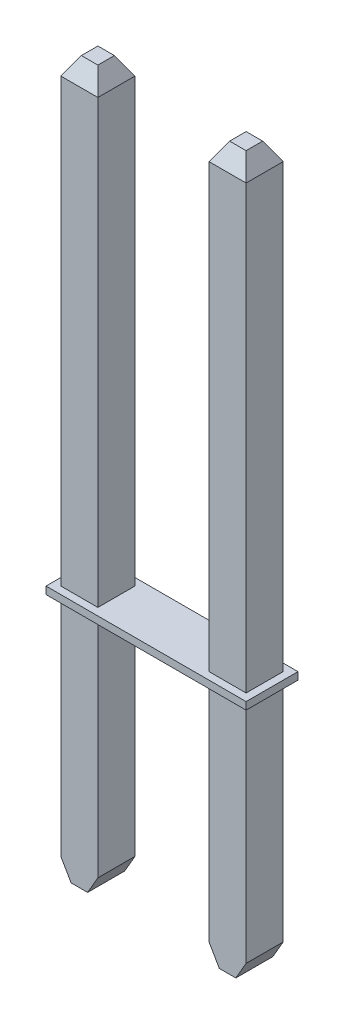
ISO-10303-21;
HEADER;
FILE_DESCRIPTION(('STEP AP214'),'2;1');
FILE_NAME('part.step','',(''),(''),'','','');
FILE_SCHEMA(('AUTOMOTIVE_DESIGN { 1 0 10303 214 1 1 1 1 }'));
ENDSEC;
DATA;
#1=APPLICATION_CONTEXT('core data for automotive mechanical design processes');
#2=APPLICATION_PROTOCOL_DEFINITION('international standard','automotive_design',2000,#1);
#3=PRODUCT_CONTEXT('',#1,'mechanical');
#4=PRODUCT('Part','Part','',(#3));
#5=PRODUCT_RELATED_PRODUCT_CATEGORY('part','',(#4));
#6=PRODUCT_DEFINITION_FORMATION('','',#4);
#7=PRODUCT_DEFINITION_CONTEXT('part definition',#1,'design');
#8=PRODUCT_DEFINITION('design','',#6,#7);
#9=PRODUCT_DEFINITION_SHAPE('','',#8);
#10=(LENGTH_UNIT() NAMED_UNIT(*) SI_UNIT(.MILLI.,.METRE.));
#11=(NAMED_UNIT(*) PLANE_ANGLE_UNIT() SI_UNIT($,.RADIAN.));
#12=(NAMED_UNIT(*) SI_UNIT($,.STERADIAN.) SOLID_ANGLE_UNIT());
#13=UNCERTAINTY_MEASURE_WITH_UNIT(LENGTH_MEASURE(1.E-05),#10,'distance_accuracy_value','');
#14=(GEOMETRIC_REPRESENTATION_CONTEXT(3) GLOBAL_UNCERTAINTY_ASSIGNED_CONTEXT((#13)) GLOBAL_UNIT_ASSIGNED_CONTEXT((#10,
#11,#12)) REPRESENTATION_CONTEXT('',''));
#15=CARTESIAN_POINT('',(0.,0.,0.));
#16=DIRECTION('',(0.,0.,1.));
#17=DIRECTION('',(1.,0.,0.));
#18=AXIS2_PLACEMENT_3D('',#15,#16,#17);
#19=CARTESIAN_POINT('',(0.,0.,-0.3175));
#20=DIRECTION('',(0.,0.,1.));
#21=DIRECTION('',(1.,0.,0.));
#22=AXIS2_PLACEMENT_3D('',#19,#20,#21);
#23=PLANE('',#22);
#24=DIRECTION('',(0.,1.,0.));
#25=VECTOR('',#24,1.);
#26=CARTESIAN_POINT('',(-1.5875,12.192,-0.3175));
#27=LINE('',#26,#25);
#28=CARTESIAN_POINT('',(-1.5875,0.3048,-0.3175));
#29=VERTEX_POINT('',#28);
#30=CARTESIAN_POINT('',(-1.5875,4.191,-0.3175));
#31=VERTEX_POINT('',#30);
#32=EDGE_CURVE('E11',#29,#31,#27,.T.);
#33=ORIENTED_EDGE('',*,*,#32,.T.);
#34=DIRECTION('',(-1.,0.,0.));
#35=VECTOR('',#34,1.);
#36=CARTESIAN_POINT('',(0.,4.191,-0.3175));
#37=LINE('',#36,#35);
#38=CARTESIAN_POINT('',(-0.9525,4.191,-0.3175));
#39=VERTEX_POINT('',#38);
#40=EDGE_CURVE('E467',#39,#31,#37,.T.);
#41=ORIENTED_EDGE('',*,*,#40,.F.);
#42=DIRECTION('',(0.,1.,0.));
#43=VECTOR('',#42,1.);
#44=CARTESIAN_POINT('',(-0.9525,4.191,-0.3175));
#45=LINE('',#44,#43);
#46=CARTESIAN_POINT('',(-0.9525,0.3048,-0.3175));
#47=VERTEX_POINT('',#46);
#48=EDGE_CURVE('E299',#47,#39,#45,.T.);
#49=ORIENTED_EDGE('',*,*,#48,.F.);
#50=DIRECTION('',(0.50000000000019,0.866025403784329,0.));
#51=VECTOR('',#50,1.);
#52=CARTESIAN_POINT('',(-0.9525,0.3048,-0.3175));
#53=LINE('',#52,#51);
#54=CARTESIAN_POINT('',(-1.128476362049,0.,-0.3175));
#55=VERTEX_POINT('',#54);
#56=EDGE_CURVE('E295',#55,#47,#53,.T.);
#57=ORIENTED_EDGE('',*,*,#56,.F.);
#58=DIRECTION('',(-1.,0.,0.));
#59=VECTOR('',#58,1.);
#60=CARTESIAN_POINT('',(-1.5875,0.,-0.3175));
#61=LINE('',#60,#59);
#62=CARTESIAN_POINT('',(-1.411523637951,0.,-0.3175));
#63=VERTEX_POINT('',#62);
#64=EDGE_CURVE('E311',#55,#63,#61,.T.);
#65=ORIENTED_EDGE('',*,*,#64,.T.);
#66=DIRECTION('',(0.50000000000019,-0.866025403784329,0.));
#67=VECTOR('',#66,1.);
#68=CARTESIAN_POINT('',(-1.411523637951,0.,-0.3175));
#69=LINE('',#68,#67);
#70=EDGE_CURVE('E25',#29,#63,#69,.T.);
#71=ORIENTED_EDGE('',*,*,#70,.F.);
#72=EDGE_LOOP('',(#33,#41,#49,#57,#65,#71));
#73=FACE_BOUND('',#72,.T.);
#74=ADVANCED_FACE('F17',(#73),#23,.F.);
#75=CARTESIAN_POINT('',(0.,0.,0.3175));
#76=DIRECTION('',(0.,0.,1.));
#77=DIRECTION('',(1.,0.,0.));
#78=AXIS2_PLACEMENT_3D('',#75,#76,#77);
#79=PLANE('',#78);
#80=DIRECTION('',(0.,1.,0.));
#81=VECTOR('',#80,1.);
#82=CARTESIAN_POINT('',(0.9525,-8.001,0.3175));
#83=LINE('',#82,#81);
#84=CARTESIAN_POINT('',(0.9525,0.3048,0.3175));
#85=VERTEX_POINT('',#84);
#86=CARTESIAN_POINT('',(0.9525,4.191,0.3175));
#87=VERTEX_POINT('',#86);
#88=EDGE_CURVE('E260',#85,#87,#83,.T.);
#89=ORIENTED_EDGE('',*,*,#88,.F.);
#90=DIRECTION('',(0.50000000000019,-0.866025403784329,0.));
#91=VECTOR('',#90,1.);
#92=CARTESIAN_POINT('',(0.9525,0.3048,0.3175));
#93=LINE('',#92,#91);
#94=CARTESIAN_POINT('',(1.128476362049,0.,0.3175));
#95=VERTEX_POINT('',#94);
#96=EDGE_CURVE('E264',#85,#95,#93,.T.);
#97=ORIENTED_EDGE('',*,*,#96,.T.);
#98=DIRECTION('',(1.,0.,0.));
#99=VECTOR('',#98,1.);
#100=CARTESIAN_POINT('',(0.,0.,0.3175));
#101=LINE('',#100,#99);
#102=CARTESIAN_POINT('',(1.411523637951,0.,0.3175));
#103=VERTEX_POINT('',#102);
#104=EDGE_CURVE('E292',#95,#103,#101,.T.);
#105=ORIENTED_EDGE('',*,*,#104,.T.);
#106=DIRECTION('',(0.50000000000019,0.866025403784329,0.));
#107=VECTOR('',#106,1.);
#108=CARTESIAN_POINT('',(1.411523637951,0.,0.3175));
#109=LINE('',#108,#107);
#110=CARTESIAN_POINT('',(1.5875,0.3048,0.3175));
#111=VERTEX_POINT('',#110);
#112=EDGE_CURVE('E666',#103,#111,#109,.T.);
#113=ORIENTED_EDGE('',*,*,#112,.T.);
#114=DIRECTION('',(0.,1.,0.));
#115=VECTOR('',#114,1.);
#116=CARTESIAN_POINT('',(1.5875,0.,0.3175));
#117=LINE('',#116,#115);
#118=CARTESIAN_POINT('',(1.5875,4.191,0.3175));
#119=VERTEX_POINT('',#118);
#120=EDGE_CURVE('E272',#111,#119,#117,.T.);
#121=ORIENTED_EDGE('',*,*,#120,.T.);
#122=DIRECTION('',(-1.,0.,0.));
#123=VECTOR('',#122,1.);
#124=CARTESIAN_POINT('',(0.,4.191,0.3175));
#125=LINE('',#124,#123);
#126=EDGE_CURVE('E267',#119,#87,#125,.T.);
#127=ORIENTED_EDGE('',*,*,#126,.T.);
#128=EDGE_LOOP('',(#89,#97,#105,#113,#121,#127));
#129=FACE_BOUND('',#128,.T.);
#130=ADVANCED_FACE('F262',(#129),#79,.T.);
#131=CARTESIAN_POINT('',(5.08,12.192,-0.141523637951));
#132=DIRECTION('',(0.,0.50000000000019,-0.866025403784329));
#133=DIRECTION('',(-1.,0.,0.));
#134=AXIS2_PLACEMENT_3D('',#131,#132,#133);
#135=PLANE('',#134);
#136=DIRECTION('',(1.,0.,0.));
#137=VECTOR('',#136,1.);
#138=CARTESIAN_POINT('',(1.5875,12.192,-0.141523637951));
#139=LINE('',#138,#137);
#140=CARTESIAN_POINT('',(1.128476362049,12.192,-0.141523637951));
#141=VERTEX_POINT('',#140);
#142=CARTESIAN_POINT('',(1.411523637951,12.192,-0.141523637951));
#143=VERTEX_POINT('',#142);
#144=EDGE_CURVE('E662',#141,#143,#139,.T.);
#145=ORIENTED_EDGE('',*,*,#144,.T.);
#146=DIRECTION('',(-0.44721359550015,0.774596669241261,0.44721359550015));
#147=VECTOR('',#146,1.);
#148=CARTESIAN_POINT('',(1.5875,11.8872,-0.3175));
#149=LINE('',#148,#147);
#150=CARTESIAN_POINT('',(1.5875,11.8872,-0.3175));
#151=VERTEX_POINT('',#150);
#152=EDGE_CURVE('E455',#151,#143,#149,.T.);
#153=ORIENTED_EDGE('',*,*,#152,.F.);
#154=DIRECTION('',(-1.,0.,0.));
#155=VECTOR('',#154,1.);
#156=CARTESIAN_POINT('',(0.,11.8872,-0.3175));
#157=LINE('',#156,#155);
#158=CARTESIAN_POINT('',(0.9525,11.8872,-0.3175));
#159=VERTEX_POINT('',#158);
#160=EDGE_CURVE('E607',#151,#159,#157,.T.);
#161=ORIENTED_EDGE('',*,*,#160,.T.);
#162=DIRECTION('',(-0.44721359550015,-0.774596669241261,-0.44721359550015));
#163=VECTOR('',#162,1.);
#164=CARTESIAN_POINT('',(1.128476362049,12.192,-0.141523637951));
#165=LINE('',#164,#163);
#166=EDGE_CURVE('E451',#141,#159,#165,.T.);
#167=ORIENTED_EDGE('',*,*,#166,.F.);
#168=EDGE_LOOP('',(#145,#153,#161,#167));
#169=FACE_BOUND('',#168,.T.);
#170=ADVANCED_FACE('F834',(#169),#135,.T.);
#171=CARTESIAN_POINT('',(-1.5875,12.192,0.3175));
#172=DIRECTION('',(1.,0.,0.));
#173=DIRECTION('',(0.,1.,0.));
#174=AXIS2_PLACEMENT_3D('',#171,#172,#173);
#175=PLANE('',#174);
#176=DIRECTION('',(0.,-1.,0.));
#177=VECTOR('',#176,1.);
#178=CARTESIAN_POINT('',(-1.5875,0.,0.3175));
#179=LINE('',#178,#177);
#180=CARTESIAN_POINT('',(-1.5875,4.191,0.3175));
#181=VERTEX_POINT('',#180);
#182=CARTESIAN_POINT('',(-1.5875,0.3048,0.3175));
#183=VERTEX_POINT('',#182);
#184=EDGE_CURVE('E394',#181,#183,#179,.T.);
#185=ORIENTED_EDGE('',*,*,#184,.F.);
#186=DIRECTION('',(0.,0.,1.));
#187=VECTOR('',#186,1.);
#188=CARTESIAN_POINT('',(-1.5875,4.191,0.3175));
#189=LINE('',#188,#187);
#190=EDGE_CURVE('E472',#31,#181,#189,.T.);
#191=ORIENTED_EDGE('',*,*,#190,.F.);
#192=ORIENTED_EDGE('',*,*,#32,.F.);
#193=DIRECTION('',(0.,0.,-1.));
#194=VECTOR('',#193,1.);
#195=CARTESIAN_POINT('',(-1.5875,0.3048,2.54));
#196=LINE('',#195,#194);
#197=EDGE_CURVE('E310',#183,#29,#196,.T.);
#198=ORIENTED_EDGE('',*,*,#197,.F.);
#199=EDGE_LOOP('',(#185,#191,#192,#198));
#200=FACE_BOUND('',#199,.T.);
#201=ADVANCED_FACE('F838',(#200),#175,.F.);
#202=CARTESIAN_POINT('',(-1.411523637951,0.,2.54));
#203=DIRECTION('',(-0.866025403784329,-0.50000000000019,0.));
#204=DIRECTION('',(-0.50000000000019,0.866025403784329,0.));
#205=AXIS2_PLACEMENT_3D('',#202,#203,#204);
#206=PLANE('',#205);
#207=DIRECTION('',(0.50000000000019,-0.866025403784329,0.));
#208=VECTOR('',#207,1.);
#209=CARTESIAN_POINT('',(-1.5875,0.3048,0.3175));
#210=LINE('',#209,#208);
#211=CARTESIAN_POINT('',(-1.411523637951,0.,0.3175));
#212=VERTEX_POINT('',#211);
#213=EDGE_CURVE('E627',#183,#212,#210,.T.);
#214=ORIENTED_EDGE('',*,*,#213,.F.);
#215=ORIENTED_EDGE('',*,*,#197,.T.);
#216=ORIENTED_EDGE('',*,*,#70,.T.);
#217=DIRECTION('',(0.,0.,1.));
#218=VECTOR('',#217,1.);
#219=CARTESIAN_POINT('',(-1.411523637951,0.,0.3175));
#220=LINE('',#219,#218);
#221=EDGE_CURVE('E307',#63,#212,#220,.T.);
#222=ORIENTED_EDGE('',*,*,#221,.T.);
#223=EDGE_LOOP('',(#214,#215,#216,#222));
#224=FACE_BOUND('',#223,.T.);
#225=ADVANCED_FACE('F852',(#224),#206,.T.);
#226=CARTESIAN_POINT('',(-1.5875,0.,0.3175));
#227=DIRECTION('',(0.,1.,0.));
#228=DIRECTION('',(1.,0.,0.));
#229=AXIS2_PLACEMENT_3D('',#226,#227,#228);
#230=PLANE('',#229);
#231=ORIENTED_EDGE('',*,*,#64,.F.);
#232=DIRECTION('',(0.,0.,-1.));
#233=VECTOR('',#232,1.);
#234=CARTESIAN_POINT('',(-1.128476362049,0.,2.54));
#235=LINE('',#234,#233);
#236=CARTESIAN_POINT('',(-1.128476362049,0.,0.3175));
#237=VERTEX_POINT('',#236);
#238=EDGE_CURVE('E303',#237,#55,#235,.T.);
#239=ORIENTED_EDGE('',*,*,#238,.F.);
#240=DIRECTION('',(1.,0.,0.));
#241=VECTOR('',#240,1.);
#242=CARTESIAN_POINT('',(0.,0.,0.3175));
#243=LINE('',#242,#241);
#244=EDGE_CURVE('E608',#212,#237,#243,.T.);
#245=ORIENTED_EDGE('',*,*,#244,.F.);
#246=ORIENTED_EDGE('',*,*,#221,.F.);
#247=EDGE_LOOP('',(#231,#239,#245,#246));
#248=FACE_BOUND('',#247,.T.);
#249=ADVANCED_FACE('F850',(#248),#230,.F.);
#250=CARTESIAN_POINT('',(-0.9525,0.3048,2.54));
#251=DIRECTION('',(0.866025403784329,-0.50000000000019,0.));
#252=DIRECTION('',(0.,0.,-1.));
#253=AXIS2_PLACEMENT_3D('',#250,#251,#252);
#254=PLANE('',#253);
#255=DIRECTION('',(0.50000000000019,0.866025403784329,0.));
#256=VECTOR('',#255,1.);
#257=CARTESIAN_POINT('',(-1.128476362049,0.,0.3175));
#258=LINE('',#257,#256);
#259=CARTESIAN_POINT('',(-0.9525,0.3048,0.3175));
#260=VERTEX_POINT('',#259);
#261=EDGE_CURVE('E602',#237,#260,#258,.T.);
#262=ORIENTED_EDGE('',*,*,#261,.F.);
#263=ORIENTED_EDGE('',*,*,#238,.T.);
#264=ORIENTED_EDGE('',*,*,#56,.T.);
#265=DIRECTION('',(0.,0.,-1.));
#266=VECTOR('',#265,1.);
#267=CARTESIAN_POINT('',(-0.9525,0.3048,2.54));
#268=LINE('',#267,#266);
#269=EDGE_CURVE('E302',#260,#47,#268,.T.);
#270=ORIENTED_EDGE('',*,*,#269,.F.);
#271=EDGE_LOOP('',(#262,#263,#264,#270));
#272=FACE_BOUND('',#271,.T.);
#273=ADVANCED_FACE('F847',(#272),#254,.T.);
#274=CARTESIAN_POINT('',(-0.9525,4.191,2.54));
#275=DIRECTION('',(1.,0.,0.));
#276=DIRECTION('',(0.,1.,0.));
#277=AXIS2_PLACEMENT_3D('',#274,#275,#276);
#278=PLANE('',#277);
#279=ORIENTED_EDGE('',*,*,#48,.T.);
#280=DIRECTION('',(0.,0.,1.));
#281=VECTOR('',#280,1.);
#282=CARTESIAN_POINT('',(-0.9525,4.191,2.54));
#283=LINE('',#282,#281);
#284=CARTESIAN_POINT('',(-0.9525,4.191,0.3175));
#285=VERTEX_POINT('',#284);
#286=EDGE_CURVE('E473',#39,#285,#283,.T.);
#287=ORIENTED_EDGE('',*,*,#286,.T.);
#288=DIRECTION('',(0.,1.,0.));
#289=VECTOR('',#288,1.);
#290=CARTESIAN_POINT('',(-0.9525,0.,0.3175));
#291=LINE('',#290,#289);
#292=EDGE_CURVE('E390',#260,#285,#291,.T.);
#293=ORIENTED_EDGE('',*,*,#292,.F.);
#294=ORIENTED_EDGE('',*,*,#269,.T.);
#295=EDGE_LOOP('',(#279,#287,#293,#294));
#296=FACE_BOUND('',#295,.T.);
#297=ADVANCED_FACE('F843',(#296),#278,.T.);
#298=CARTESIAN_POINT('',(1.5875,0.,0.3175));
#299=DIRECTION('',(-1.,0.,0.));
#300=DIRECTION('',(0.,0.,1.));
#301=AXIS2_PLACEMENT_3D('',#298,#299,#300);
#302=PLANE('',#301);
#303=DIRECTION('',(0.,1.,0.));
#304=VECTOR('',#303,1.);
#305=CARTESIAN_POINT('',(1.5875,0.,-0.3175));
#306=LINE('',#305,#304);
#307=CARTESIAN_POINT('',(1.5875,0.3048,-0.3175));
#308=VERTEX_POINT('',#307);
#309=CARTESIAN_POINT('',(1.5875,4.191,-0.3175));
#310=VERTEX_POINT('',#309);
#311=EDGE_CURVE('E620',#308,#310,#306,.T.);
#312=ORIENTED_EDGE('',*,*,#311,.T.);
#313=DIRECTION('',(0.,0.,-1.));
#314=VECTOR('',#313,1.);
#315=CARTESIAN_POINT('',(1.5875,4.191,0.3175));
#316=LINE('',#315,#314);
#317=EDGE_CURVE('E543',#119,#310,#316,.T.);
#318=ORIENTED_EDGE('',*,*,#317,.F.);
#319=ORIENTED_EDGE('',*,*,#120,.F.);
#320=DIRECTION('',(0.,0.,1.));
#321=VECTOR('',#320,1.);
#322=CARTESIAN_POINT('',(1.5875,0.3048,2.54));
#323=LINE('',#322,#321);
#324=EDGE_CURVE('E576',#308,#111,#323,.T.);
#325=ORIENTED_EDGE('',*,*,#324,.F.);
#326=EDGE_LOOP('',(#312,#318,#319,#325));
#327=FACE_BOUND('',#326,.T.);
#328=ADVANCED_FACE('F1087',(#327),#302,.F.);
#329=CARTESIAN_POINT('',(0.9525,-8.001,2.54));
#330=DIRECTION('',(-1.,0.,0.));
#331=DIRECTION('',(0.,0.,1.));
#332=AXIS2_PLACEMENT_3D('',#329,#330,#331);
#333=PLANE('',#332);
#334=ORIENTED_EDGE('',*,*,#88,.T.);
#335=DIRECTION('',(0.,0.,-1.));
#336=VECTOR('',#335,1.);
#337=CARTESIAN_POINT('',(0.9525,4.191,2.54));
#338=LINE('',#337,#336);
#339=CARTESIAN_POINT('',(0.9525,4.191,-0.3175));
#340=VERTEX_POINT('',#339);
#341=EDGE_CURVE('E508',#87,#340,#338,.T.);
#342=ORIENTED_EDGE('',*,*,#341,.T.);
#343=DIRECTION('',(0.,-1.,0.));
#344=VECTOR('',#343,1.);
#345=CARTESIAN_POINT('',(0.9525,0.,-0.3175));
#346=LINE('',#345,#344);
#347=CARTESIAN_POINT('',(0.9525,0.3048,-0.3175));
#348=VERTEX_POINT('',#347);
#349=EDGE_CURVE('E277',#340,#348,#346,.T.);
#350=ORIENTED_EDGE('',*,*,#349,.T.);
#351=DIRECTION('',(0.,0.,-1.));
#352=VECTOR('',#351,1.);
#353=CARTESIAN_POINT('',(0.9525,0.3048,2.54));
#354=LINE('',#353,#352);
#355=EDGE_CURVE('E273',#85,#348,#354,.T.);
#356=ORIENTED_EDGE('',*,*,#355,.F.);
#357=EDGE_LOOP('',(#334,#342,#350,#356));
#358=FACE_BOUND('',#357,.T.);
#359=ADVANCED_FACE('F276',(#358),#333,.T.);
#360=CARTESIAN_POINT('',(1.128476362049,0.,2.54));
#361=DIRECTION('',(-0.866025403784329,-0.50000000000019,0.));
#362=DIRECTION('',(-0.50000000000019,0.866025403784329,0.));
#363=AXIS2_PLACEMENT_3D('',#360,#361,#362);
#364=PLANE('',#363);
#365=ORIENTED_EDGE('',*,*,#96,.F.);
#366=ORIENTED_EDGE('',*,*,#355,.T.);
#367=DIRECTION('',(0.50000000000019,-0.866025403784329,0.));
#368=VECTOR('',#367,1.);
#369=CARTESIAN_POINT('',(0.9525,0.3048,-0.3175));
#370=LINE('',#369,#368);
#371=CARTESIAN_POINT('',(1.128476362049,0.,-0.3175));
#372=VERTEX_POINT('',#371);
#373=EDGE_CURVE('E598',#348,#372,#370,.T.);
#374=ORIENTED_EDGE('',*,*,#373,.T.);
#375=DIRECTION('',(0.,0.,1.));
#376=VECTOR('',#375,1.);
#377=CARTESIAN_POINT('',(1.128476362049,0.,0.3175));
#378=LINE('',#377,#376);
#379=EDGE_CURVE('E284',#372,#95,#378,.T.);
#380=ORIENTED_EDGE('',*,*,#379,.T.);
#381=EDGE_LOOP('',(#365,#366,#374,#380));
#382=FACE_BOUND('',#381,.T.);
#383=ADVANCED_FACE('F283',(#382),#364,.T.);
#384=CARTESIAN_POINT('',(-1.5875,0.,0.3175));
#385=DIRECTION('',(0.,1.,0.));
#386=DIRECTION('',(1.,0.,0.));
#387=AXIS2_PLACEMENT_3D('',#384,#385,#386);
#388=PLANE('',#387);
#389=ORIENTED_EDGE('',*,*,#104,.F.);
#390=ORIENTED_EDGE('',*,*,#379,.F.);
#391=DIRECTION('',(1.,0.,0.));
#392=VECTOR('',#391,1.);
#393=CARTESIAN_POINT('',(0.,0.,-0.3175));
#394=LINE('',#393,#392);
#395=CARTESIAN_POINT('',(1.411523637951,0.,-0.3175));
#396=VERTEX_POINT('',#395);
#397=EDGE_CURVE('E416',#372,#396,#394,.T.);
#398=ORIENTED_EDGE('',*,*,#397,.T.);
#399=DIRECTION('',(0.,0.,-1.));
#400=VECTOR('',#399,1.);
#401=CARTESIAN_POINT('',(1.411523637951,0.,2.54));
#402=LINE('',#401,#400);
#403=EDGE_CURVE('E672',#103,#396,#402,.T.);
#404=ORIENTED_EDGE('',*,*,#403,.F.);
#405=EDGE_LOOP('',(#389,#390,#398,#404));
#406=FACE_BOUND('',#405,.T.);
#407=ADVANCED_FACE('F1050',(#406),#388,.F.);
#408=CARTESIAN_POINT('',(1.5875,0.3048,2.54));
#409=DIRECTION('',(0.866025403784329,-0.50000000000019,0.));
#410=DIRECTION('',(0.,0.,-1.));
#411=AXIS2_PLACEMENT_3D('',#408,#409,#410);
#412=PLANE('',#411);
#413=ORIENTED_EDGE('',*,*,#112,.F.);
#414=ORIENTED_EDGE('',*,*,#403,.T.);
#415=DIRECTION('',(0.50000000000019,0.866025403784329,0.));
#416=VECTOR('',#415,1.);
#417=CARTESIAN_POINT('',(1.411523637951,0.,-0.3175));
#418=LINE('',#417,#416);
#419=EDGE_CURVE('E395',#396,#308,#418,.T.);
#420=ORIENTED_EDGE('',*,*,#419,.T.);
#421=ORIENTED_EDGE('',*,*,#324,.T.);
#422=EDGE_LOOP('',(#413,#414,#420,#421));
#423=FACE_BOUND('',#422,.T.);
#424=ADVANCED_FACE('F1038',(#423),#412,.T.);
#425=CARTESIAN_POINT('',(1.5875,12.192,0.3175));
#426=DIRECTION('',(0.,-1.,0.));
#427=DIRECTION('',(0.,0.,-1.));
#428=AXIS2_PLACEMENT_3D('',#425,#426,#427);
#429=PLANE('',#428);
#430=DIRECTION('',(-1.,0.,0.));
#431=VECTOR('',#430,1.);
#432=CARTESIAN_POINT('',(5.08,12.192,0.141523637951));
#433=LINE('',#432,#431);
#434=CARTESIAN_POINT('',(1.411523637951,12.192,0.141523637951));
#435=VERTEX_POINT('',#434);
#436=CARTESIAN_POINT('',(1.128476362049,12.192,0.141523637951));
#437=VERTEX_POINT('',#436);
#438=EDGE_CURVE('E435',#435,#437,#433,.T.);
#439=ORIENTED_EDGE('',*,*,#438,.F.);
#440=DIRECTION('',(0.,0.,1.));
#441=VECTOR('',#440,1.);
#442=CARTESIAN_POINT('',(1.411523637951,12.192,2.54));
#443=LINE('',#442,#441);
#444=EDGE_CURVE('E658',#143,#435,#443,.T.);
#445=ORIENTED_EDGE('',*,*,#444,.F.);
#446=ORIENTED_EDGE('',*,*,#144,.F.);
#447=DIRECTION('',(0.,0.,-1.));
#448=VECTOR('',#447,1.);
#449=CARTESIAN_POINT('',(1.128476362049,12.192,2.54));
#450=LINE('',#449,#448);
#451=EDGE_CURVE('E456',#437,#141,#450,.T.);
#452=ORIENTED_EDGE('',*,*,#451,.F.);
#453=EDGE_LOOP('',(#439,#445,#446,#452));
#454=FACE_BOUND('',#453,.T.);
#455=ADVANCED_FACE('F1027',(#454),#429,.F.);
#456=CARTESIAN_POINT('',(1.411523637951,12.192,2.54));
#457=DIRECTION('',(0.866025403784329,0.50000000000019,0.));
#458=DIRECTION('',(0.,0.,-1.));
#459=AXIS2_PLACEMENT_3D('',#456,#457,#458);
#460=PLANE('',#459);
#461=DIRECTION('',(0.,0.,-1.));
#462=VECTOR('',#461,1.);
#463=CARTESIAN_POINT('',(1.5875,11.8872,0.3175));
#464=LINE('',#463,#462);
#465=CARTESIAN_POINT('',(1.5875,11.8872,0.3175));
#466=VERTEX_POINT('',#465);
#467=EDGE_CURVE('E376',#466,#151,#464,.T.);
#468=ORIENTED_EDGE('',*,*,#467,.T.);
#469=ORIENTED_EDGE('',*,*,#152,.T.);
#470=ORIENTED_EDGE('',*,*,#444,.T.);
#471=DIRECTION('',(-0.44721359550015,0.774596669241261,-0.44721359550015));
#472=VECTOR('',#471,1.);
#473=CARTESIAN_POINT('',(1.5875,11.8872,0.3175));
#474=LINE('',#473,#472);
#475=EDGE_CURVE('E440',#466,#435,#474,.T.);
#476=ORIENTED_EDGE('',*,*,#475,.F.);
#477=EDGE_LOOP('',(#468,#469,#470,#476));
#478=FACE_BOUND('',#477,.T.);
#479=ADVANCED_FACE('F1016',(#478),#460,.T.);
#480=CARTESIAN_POINT('',(0.9525,11.8872,2.54));
#481=DIRECTION('',(-0.866025403784329,0.50000000000019,0.));
#482=DIRECTION('',(0.,0.,1.));
#483=AXIS2_PLACEMENT_3D('',#480,#481,#482);
#484=PLANE('',#483);
#485=ORIENTED_EDGE('',*,*,#451,.T.);
#486=ORIENTED_EDGE('',*,*,#166,.T.);
#487=DIRECTION('',(0.,0.,-1.));
#488=VECTOR('',#487,1.);
#489=CARTESIAN_POINT('',(0.9525,11.8872,2.54));
#490=LINE('',#489,#488);
#491=CARTESIAN_POINT('',(0.9525,11.8872,0.3175));
#492=VERTEX_POINT('',#491);
#493=EDGE_CURVE('E582',#492,#159,#490,.T.);
#494=ORIENTED_EDGE('',*,*,#493,.F.);
#495=DIRECTION('',(-0.44721359550015,-0.774596669241261,0.44721359550015));
#496=VECTOR('',#495,1.);
#497=CARTESIAN_POINT('',(1.128476362049,12.192,0.141523637951));
#498=LINE('',#497,#496);
#499=EDGE_CURVE('E377',#437,#492,#498,.T.);
#500=ORIENTED_EDGE('',*,*,#499,.F.);
#501=EDGE_LOOP('',(#485,#486,#494,#500));
#502=FACE_BOUND('',#501,.T.);
#503=ADVANCED_FACE('F866',(#502),#484,.T.);
#504=CARTESIAN_POINT('',(0.,0.,-0.3175));
#505=DIRECTION('',(0.,0.,1.));
#506=DIRECTION('',(1.,0.,0.));
#507=AXIS2_PLACEMENT_3D('',#504,#505,#506);
#508=PLANE('',#507);
#509=DIRECTION('',(0.,-1.,0.));
#510=VECTOR('',#509,1.);
#511=CARTESIAN_POINT('',(1.5875,0.,-0.3175));
#512=LINE('',#511,#510);
#513=CARTESIAN_POINT('',(1.5875,4.318,-0.3175));
#514=VERTEX_POINT('',#513);
#515=EDGE_CURVE('E372',#151,#514,#512,.T.);
#516=ORIENTED_EDGE('',*,*,#515,.T.);
#517=DIRECTION('',(1.,0.,0.));
#518=VECTOR('',#517,1.);
#519=CARTESIAN_POINT('',(0.,4.318,-0.3175));
#520=LINE('',#519,#518);
#521=CARTESIAN_POINT('',(0.9525,4.318,-0.3175));
#522=VERTEX_POINT('',#521);
#523=EDGE_CURVE('E723',#522,#514,#520,.T.);
#524=ORIENTED_EDGE('',*,*,#523,.F.);
#525=DIRECTION('',(0.,-1.,0.));
#526=VECTOR('',#525,1.);
#527=CARTESIAN_POINT('',(0.9525,4.318,-0.3175));
#528=LINE('',#527,#526);
#529=EDGE_CURVE('E569',#159,#522,#528,.T.);
#530=ORIENTED_EDGE('',*,*,#529,.F.);
#531=ORIENTED_EDGE('',*,*,#160,.F.);
#532=EDGE_LOOP('',(#516,#524,#530,#531));
#533=FACE_BOUND('',#532,.T.);
#534=ADVANCED_FACE('F857',(#533),#508,.F.);
#535=CARTESIAN_POINT('',(0.,0.,0.3175));
#536=DIRECTION('',(0.,0.,1.));
#537=DIRECTION('',(1.,0.,0.));
#538=AXIS2_PLACEMENT_3D('',#535,#536,#537);
#539=PLANE('',#538);
#540=ORIENTED_EDGE('',*,*,#292,.T.);
#541=DIRECTION('',(-1.,0.,0.));
#542=VECTOR('',#541,1.);
#543=CARTESIAN_POINT('',(1.7145,4.191,0.3175));
#544=LINE('',#543,#542);
#545=EDGE_CURVE('E562',#285,#181,#544,.T.);
#546=ORIENTED_EDGE('',*,*,#545,.T.);
#547=ORIENTED_EDGE('',*,*,#184,.T.);
#548=ORIENTED_EDGE('',*,*,#213,.T.);
#549=ORIENTED_EDGE('',*,*,#244,.T.);
#550=ORIENTED_EDGE('',*,*,#261,.T.);
#551=EDGE_LOOP('',(#540,#546,#547,#548,#549,#550));
#552=FACE_BOUND('',#551,.T.);
#553=ADVANCED_FACE('F854',(#552),#539,.T.);
#554=CARTESIAN_POINT('',(0.,0.,-0.3175));
#555=DIRECTION('',(0.,0.,1.));
#556=DIRECTION('',(1.,0.,0.));
#557=AXIS2_PLACEMENT_3D('',#554,#555,#556);
#558=PLANE('',#557);
#559=ORIENTED_EDGE('',*,*,#397,.F.);
#560=ORIENTED_EDGE('',*,*,#373,.F.);
#561=ORIENTED_EDGE('',*,*,#349,.F.);
#562=DIRECTION('',(1.,0.,0.));
#563=VECTOR('',#562,1.);
#564=CARTESIAN_POINT('',(1.7145,4.191,-0.3175));
#565=LINE('',#564,#563);
#566=EDGE_CURVE('E550',#340,#310,#565,.T.);
#567=ORIENTED_EDGE('',*,*,#566,.T.);
#568=ORIENTED_EDGE('',*,*,#311,.F.);
#569=ORIENTED_EDGE('',*,*,#419,.F.);
#570=EDGE_LOOP('',(#559,#560,#561,#567,#568,#569));
#571=FACE_BOUND('',#570,.T.);
#572=ADVANCED_FACE('F856',(#571),#558,.F.);
#573=CARTESIAN_POINT('',(-1.5875,11.8872,2.54));
#574=DIRECTION('',(-0.866025403784329,0.50000000000019,0.));
#575=DIRECTION('',(0.,0.,1.));
#576=AXIS2_PLACEMENT_3D('',#573,#574,#575);
#577=PLANE('',#576);
#578=DIRECTION('',(0.,0.,-1.));
#579=VECTOR('',#578,1.);
#580=CARTESIAN_POINT('',(-1.411523637951,12.192,0.3175));
#581=LINE('',#580,#579);
#582=CARTESIAN_POINT('',(-1.411523637951,12.192,0.141523637951));
#583=VERTEX_POINT('',#582);
#584=CARTESIAN_POINT('',(-1.411523637951,12.192,-0.141523637951));
#585=VERTEX_POINT('',#584);
#586=EDGE_CURVE('E512',#583,#585,#581,.T.);
#587=ORIENTED_EDGE('',*,*,#586,.T.);
#588=DIRECTION('',(0.44721359550015,0.774596669241261,0.44721359550015));
#589=VECTOR('',#588,1.);
#590=CARTESIAN_POINT('',(-1.5875,11.8872,-0.3175));
#591=LINE('',#590,#589);
#592=CARTESIAN_POINT('',(-1.5875,11.8872,-0.3175));
#593=VERTEX_POINT('',#592);
#594=EDGE_CURVE('E530',#593,#585,#591,.T.);
#595=ORIENTED_EDGE('',*,*,#594,.F.);
#596=DIRECTION('',(0.,0.,1.));
#597=VECTOR('',#596,1.);
#598=CARTESIAN_POINT('',(-1.5875,11.8872,0.3175));
#599=LINE('',#598,#597);
#600=CARTESIAN_POINT('',(-1.5875,11.8872,0.3175));
#601=VERTEX_POINT('',#600);
#602=EDGE_CURVE('E499',#593,#601,#599,.T.);
#603=ORIENTED_EDGE('',*,*,#602,.T.);
#604=DIRECTION('',(-0.44721359550015,-0.774596669241261,0.44721359550015));
#605=VECTOR('',#604,1.);
#606=CARTESIAN_POINT('',(-1.411523637951,12.192,0.141523637951));
#607=LINE('',#606,#605);
#608=EDGE_CURVE('E520',#583,#601,#607,.T.);
#609=ORIENTED_EDGE('',*,*,#608,.F.);
#610=EDGE_LOOP('',(#587,#595,#603,#609));
#611=FACE_BOUND('',#610,.T.);
#612=ADVANCED_FACE('F811',(#611),#577,.T.);
#613=CARTESIAN_POINT('',(1.5875,0.,0.3175));
#614=DIRECTION('',(-1.,0.,0.));
#615=DIRECTION('',(0.,0.,1.));
#616=AXIS2_PLACEMENT_3D('',#613,#614,#615);
#617=PLANE('',#616);
#618=DIRECTION('',(0.,1.,0.));
#619=VECTOR('',#618,1.);
#620=CARTESIAN_POINT('',(1.5875,0.,0.3175));
#621=LINE('',#620,#619);
#622=CARTESIAN_POINT('',(1.5875,4.318,0.3175));
#623=VERTEX_POINT('',#622);
#624=EDGE_CURVE('E488',#623,#466,#621,.T.);
#625=ORIENTED_EDGE('',*,*,#624,.F.);
#626=DIRECTION('',(0.,0.,1.));
#627=VECTOR('',#626,1.);
#628=CARTESIAN_POINT('',(1.5875,4.318,0.3175));
#629=LINE('',#628,#627);
#630=EDGE_CURVE('E722',#514,#623,#629,.T.);
#631=ORIENTED_EDGE('',*,*,#630,.F.);
#632=ORIENTED_EDGE('',*,*,#515,.F.);
#633=ORIENTED_EDGE('',*,*,#467,.F.);
#634=EDGE_LOOP('',(#625,#631,#632,#633));
#635=FACE_BOUND('',#634,.T.);
#636=ADVANCED_FACE('F881',(#635),#617,.F.);
#637=CARTESIAN_POINT('',(5.08,11.8872,0.3175));
#638=DIRECTION('',(0.,0.50000000000019,0.866025403784329));
#639=DIRECTION('',(1.,0.,0.));
#640=AXIS2_PLACEMENT_3D('',#637,#638,#639);
#641=PLANE('',#640);
#642=DIRECTION('',(-1.,0.,0.));
#643=VECTOR('',#642,1.);
#644=CARTESIAN_POINT('',(0.,11.8872,0.3175));
#645=LINE('',#644,#643);
#646=EDGE_CURVE('E495',#466,#492,#645,.T.);
#647=ORIENTED_EDGE('',*,*,#646,.F.);
#648=ORIENTED_EDGE('',*,*,#475,.T.);
#649=ORIENTED_EDGE('',*,*,#438,.T.);
#650=ORIENTED_EDGE('',*,*,#499,.T.);
#651=EDGE_LOOP('',(#647,#648,#649,#650));
#652=FACE_BOUND('',#651,.T.);
#653=ADVANCED_FACE('F878',(#652),#641,.T.);
#654=CARTESIAN_POINT('',(0.9525,4.318,2.54));
#655=DIRECTION('',(-1.,0.,0.));
#656=DIRECTION('',(0.,0.,1.));
#657=AXIS2_PLACEMENT_3D('',#654,#655,#656);
#658=PLANE('',#657);
#659=ORIENTED_EDGE('',*,*,#529,.T.);
#660=DIRECTION('',(0.,0.,1.));
#661=VECTOR('',#660,1.);
#662=CARTESIAN_POINT('',(0.9525,4.318,2.54));
#663=LINE('',#662,#661);
#664=CARTESIAN_POINT('',(0.9525,4.318,0.3175));
#665=VERTEX_POINT('',#664);
#666=EDGE_CURVE('E727',#522,#665,#663,.T.);
#667=ORIENTED_EDGE('',*,*,#666,.T.);
#668=DIRECTION('',(0.,-1.,0.));
#669=VECTOR('',#668,1.);
#670=CARTESIAN_POINT('',(0.9525,0.,0.3175));
#671=LINE('',#670,#669);
#672=EDGE_CURVE('E482',#492,#665,#671,.T.);
#673=ORIENTED_EDGE('',*,*,#672,.F.);
#674=ORIENTED_EDGE('',*,*,#493,.T.);
#675=EDGE_LOOP('',(#659,#667,#673,#674));
#676=FACE_BOUND('',#675,.T.);
#677=ADVANCED_FACE('F824',(#676),#658,.T.);
#678=CARTESIAN_POINT('',(1.7145,4.191,0.4445));
#679=DIRECTION('',(0.,1.,0.));
#680=DIRECTION('',(1.,0.,0.));
#681=AXIS2_PLACEMENT_3D('',#678,#679,#680);
#682=PLANE('',#681);
#683=ORIENTED_EDGE('',*,*,#286,.F.);
#684=ORIENTED_EDGE('',*,*,#40,.T.);
#685=ORIENTED_EDGE('',*,*,#190,.T.);
#686=ORIENTED_EDGE('',*,*,#545,.F.);
#687=EDGE_LOOP('',(#683,#684,#685,#686));
#688=FACE_BOUND('',#687,.T.);
#689=ORIENTED_EDGE('',*,*,#341,.F.);
#690=ORIENTED_EDGE('',*,*,#126,.F.);
#691=ORIENTED_EDGE('',*,*,#317,.T.);
#692=ORIENTED_EDGE('',*,*,#566,.F.);
#693=EDGE_LOOP('',(#689,#690,#691,#692));
#694=FACE_BOUND('',#693,.T.);
#695=DIRECTION('',(1.,0.,0.));
#696=VECTOR('',#695,1.);
#697=CARTESIAN_POINT('',(1.7145,4.191,-0.4445));
#698=LINE('',#697,#696);
#699=CARTESIAN_POINT('',(-1.7145,4.191,-0.4445));
#700=VERTEX_POINT('',#699);
#701=CARTESIAN_POINT('',(1.7145,4.191,-0.4445));
#702=VERTEX_POINT('',#701);
#703=EDGE_CURVE('E409',#700,#702,#698,.T.);
#704=ORIENTED_EDGE('',*,*,#703,.T.);
#705=DIRECTION('',(0.,0.,-1.));
#706=VECTOR('',#705,1.);
#707=CARTESIAN_POINT('',(1.7145,4.191,0.));
#708=LINE('',#707,#706);
#709=CARTESIAN_POINT('',(1.7145,4.191,0.4445));
#710=VERTEX_POINT('',#709);
#711=EDGE_CURVE('E478',#710,#702,#708,.T.);
#712=ORIENTED_EDGE('',*,*,#711,.F.);
#713=DIRECTION('',(-1.,0.,0.));
#714=VECTOR('',#713,1.);
#715=CARTESIAN_POINT('',(1.7145,4.191,0.4445));
#716=LINE('',#715,#714);
#717=CARTESIAN_POINT('',(-1.7145,4.191,0.4445));
#718=VERTEX_POINT('',#717);
#719=EDGE_CURVE('E447',#710,#718,#716,.T.);
#720=ORIENTED_EDGE('',*,*,#719,.T.);
#721=DIRECTION('',(0.,0.,-1.));
#722=VECTOR('',#721,1.);
#723=CARTESIAN_POINT('',(-1.7145,4.191,0.));
#724=LINE('',#723,#722);
#725=EDGE_CURVE('E425',#718,#700,#724,.T.);
#726=ORIENTED_EDGE('',*,*,#725,.T.);
#727=EDGE_LOOP('',(#704,#712,#720,#726));
#728=FACE_BOUND('',#727,.T.);
#729=ADVANCED_FACE('F815',(#688,#694,#728),#682,.F.);
#730=CARTESIAN_POINT('',(1.5875,12.192,0.3175));
#731=DIRECTION('',(0.,-1.,0.));
#732=DIRECTION('',(0.,0.,-1.));
#733=AXIS2_PLACEMENT_3D('',#730,#731,#732);
#734=PLANE('',#733);
#735=DIRECTION('',(-1.,0.,0.));
#736=VECTOR('',#735,1.);
#737=CARTESIAN_POINT('',(5.08,12.192,0.141523637951));
#738=LINE('',#737,#736);
#739=CARTESIAN_POINT('',(-1.128476362049,12.192,0.141523637951));
#740=VERTEX_POINT('',#739);
#741=EDGE_CURVE('E504',#740,#583,#738,.T.);
#742=ORIENTED_EDGE('',*,*,#741,.F.);
#743=DIRECTION('',(0.,0.,1.));
#744=VECTOR('',#743,1.);
#745=CARTESIAN_POINT('',(-1.128476362049,12.192,2.54));
#746=LINE('',#745,#744);
#747=CARTESIAN_POINT('',(-1.128476362049,12.192,-0.141523637951));
#748=VERTEX_POINT('',#747);
#749=EDGE_CURVE('E689',#748,#740,#746,.T.);
#750=ORIENTED_EDGE('',*,*,#749,.F.);
#751=DIRECTION('',(1.,0.,0.));
#752=VECTOR('',#751,1.);
#753=CARTESIAN_POINT('',(5.08,12.192,-0.141523637951));
#754=LINE('',#753,#752);
#755=EDGE_CURVE('E526',#585,#748,#754,.T.);
#756=ORIENTED_EDGE('',*,*,#755,.F.);
#757=ORIENTED_EDGE('',*,*,#586,.F.);
#758=EDGE_LOOP('',(#742,#750,#756,#757));
#759=FACE_BOUND('',#758,.T.);
#760=ADVANCED_FACE('F813',(#759),#734,.F.);
#761=CARTESIAN_POINT('',(5.08,12.192,-0.141523637951));
#762=DIRECTION('',(0.,0.50000000000019,-0.866025403784329));
#763=DIRECTION('',(-1.,0.,0.));
#764=AXIS2_PLACEMENT_3D('',#761,#762,#763);
#765=PLANE('',#764);
#766=ORIENTED_EDGE('',*,*,#755,.T.);
#767=DIRECTION('',(-0.44721359550015,0.774596669241261,0.44721359550015));
#768=VECTOR('',#767,1.);
#769=CARTESIAN_POINT('',(-0.9525,11.8872,-0.3175));
#770=LINE('',#769,#768);
#771=CARTESIAN_POINT('',(-0.9525,11.8872,-0.3175));
#772=VERTEX_POINT('',#771);
#773=EDGE_CURVE('E697',#772,#748,#770,.T.);
#774=ORIENTED_EDGE('',*,*,#773,.F.);
#775=DIRECTION('',(-1.,0.,0.));
#776=VECTOR('',#775,1.);
#777=CARTESIAN_POINT('',(0.,11.8872,-0.3175));
#778=LINE('',#777,#776);
#779=EDGE_CURVE('E386',#772,#593,#778,.T.);
#780=ORIENTED_EDGE('',*,*,#779,.T.);
#781=ORIENTED_EDGE('',*,*,#594,.T.);
#782=EDGE_LOOP('',(#766,#774,#780,#781));
#783=FACE_BOUND('',#782,.T.);
#784=ADVANCED_FACE('F796',(#783),#765,.T.);
#785=CARTESIAN_POINT('',(5.08,11.8872,0.3175));
#786=DIRECTION('',(0.,0.50000000000019,0.866025403784329));
#787=DIRECTION('',(1.,0.,0.));
#788=AXIS2_PLACEMENT_3D('',#785,#786,#787);
#789=PLANE('',#788);
#790=DIRECTION('',(-1.,0.,0.));
#791=VECTOR('',#790,1.);
#792=CARTESIAN_POINT('',(0.,11.8872,0.3175));
#793=LINE('',#792,#791);
#794=CARTESIAN_POINT('',(-0.9525,11.8872,0.3175));
#795=VERTEX_POINT('',#794);
#796=EDGE_CURVE('E703',#795,#601,#793,.T.);
#797=ORIENTED_EDGE('',*,*,#796,.F.);
#798=DIRECTION('',(0.44721359550015,-0.774596669241261,0.44721359550015));
#799=VECTOR('',#798,1.);
#800=CARTESIAN_POINT('',(-1.128476362049,12.192,0.141523637951));
#801=LINE('',#800,#799);
#802=EDGE_CURVE('E368',#740,#795,#801,.T.);
#803=ORIENTED_EDGE('',*,*,#802,.F.);
#804=ORIENTED_EDGE('',*,*,#741,.T.);
#805=ORIENTED_EDGE('',*,*,#608,.T.);
#806=EDGE_LOOP('',(#797,#803,#804,#805));
#807=FACE_BOUND('',#806,.T.);
#808=ADVANCED_FACE('F810',(#807),#789,.T.);
#809=CARTESIAN_POINT('',(-1.5875,12.192,0.3175));
#810=DIRECTION('',(1.,0.,0.));
#811=DIRECTION('',(0.,1.,0.));
#812=AXIS2_PLACEMENT_3D('',#809,#810,#811);
#813=PLANE('',#812);
#814=DIRECTION('',(0.,-1.,0.));
#815=VECTOR('',#814,1.);
#816=CARTESIAN_POINT('',(-1.5875,0.,-0.3175));
#817=LINE('',#816,#815);
#818=CARTESIAN_POINT('',(-1.5875,4.318,-0.3175));
#819=VERTEX_POINT('',#818);
#820=EDGE_CURVE('E382',#593,#819,#817,.T.);
#821=ORIENTED_EDGE('',*,*,#820,.T.);
#822=DIRECTION('',(0.,0.,-1.));
#823=VECTOR('',#822,1.);
#824=CARTESIAN_POINT('',(-1.5875,4.318,0.3175));
#825=LINE('',#824,#823);
#826=CARTESIAN_POINT('',(-1.5875,4.318,0.3175));
#827=VERTEX_POINT('',#826);
#828=EDGE_CURVE('E711',#827,#819,#825,.T.);
#829=ORIENTED_EDGE('',*,*,#828,.F.);
#830=DIRECTION('',(0.,-1.,0.));
#831=VECTOR('',#830,1.);
#832=CARTESIAN_POINT('',(-1.5875,0.,0.3175));
#833=LINE('',#832,#831);
#834=EDGE_CURVE('E705',#601,#827,#833,.T.);
#835=ORIENTED_EDGE('',*,*,#834,.F.);
#836=ORIENTED_EDGE('',*,*,#602,.F.);
#837=EDGE_LOOP('',(#821,#829,#835,#836));
#838=FACE_BOUND('',#837,.T.);
#839=ADVANCED_FACE('F790',(#838),#813,.F.);
#840=CARTESIAN_POINT('',(0.,0.,0.3175));
#841=DIRECTION('',(0.,0.,1.));
#842=DIRECTION('',(1.,0.,0.));
#843=AXIS2_PLACEMENT_3D('',#840,#841,#842);
#844=PLANE('',#843);
#845=ORIENTED_EDGE('',*,*,#672,.T.);
#846=DIRECTION('',(1.,0.,0.));
#847=VECTOR('',#846,1.);
#848=CARTESIAN_POINT('',(1.7145,4.318,0.3175));
#849=LINE('',#848,#847);
#850=EDGE_CURVE('E718',#665,#623,#849,.T.);
#851=ORIENTED_EDGE('',*,*,#850,.T.);
#852=ORIENTED_EDGE('',*,*,#624,.T.);
#853=ORIENTED_EDGE('',*,*,#646,.T.);
#854=EDGE_LOOP('',(#845,#851,#852,#853));
#855=FACE_BOUND('',#854,.T.);
#856=ADVANCED_FACE('F871',(#855),#844,.T.);
#857=CARTESIAN_POINT('',(1.7145,0.,0.));
#858=DIRECTION('',(1.,0.,0.));
#859=DIRECTION('',(0.,1.,0.));
#860=AXIS2_PLACEMENT_3D('',#857,#858,#859);
#861=PLANE('',#860);
#862=ORIENTED_EDGE('',*,*,#711,.T.);
#863=DIRECTION('',(0.,1.,0.));
#864=VECTOR('',#863,1.);
#865=CARTESIAN_POINT('',(1.7145,4.191,-0.4445));
#866=LINE('',#865,#864);
#867=CARTESIAN_POINT('',(1.7145,4.318,-0.4445));
#868=VERTEX_POINT('',#867);
#869=EDGE_CURVE('E403',#702,#868,#866,.T.);
#870=ORIENTED_EDGE('',*,*,#869,.T.);
#871=DIRECTION('',(0.,0.,1.));
#872=VECTOR('',#871,1.);
#873=CARTESIAN_POINT('',(1.7145,4.318,-0.4445));
#874=LINE('',#873,#872);
#875=CARTESIAN_POINT('',(1.7145,4.318,0.4445));
#876=VERTEX_POINT('',#875);
#877=EDGE_CURVE('E732',#868,#876,#874,.T.);
#878=ORIENTED_EDGE('',*,*,#877,.T.);
#879=DIRECTION('',(0.,-1.,0.));
#880=VECTOR('',#879,1.);
#881=CARTESIAN_POINT('',(1.7145,4.318,0.4445));
#882=LINE('',#881,#880);
#883=EDGE_CURVE('E463',#876,#710,#882,.T.);
#884=ORIENTED_EDGE('',*,*,#883,.T.);
#885=EDGE_LOOP('',(#862,#870,#878,#884));
#886=FACE_BOUND('',#885,.T.);
#887=ADVANCED_FACE('F888',(#886),#861,.T.);
#888=CARTESIAN_POINT('',(1.7145,4.318,0.4445));
#889=DIRECTION('',(0.,0.,-1.));
#890=DIRECTION('',(0.,-1.,0.));
#891=AXIS2_PLACEMENT_3D('',#888,#889,#890);
#892=PLANE('',#891);
#893=ORIENTED_EDGE('',*,*,#719,.F.);
#894=ORIENTED_EDGE('',*,*,#883,.F.);
#895=DIRECTION('',(-1.,0.,0.));
#896=VECTOR('',#895,1.);
#897=CARTESIAN_POINT('',(1.7145,4.318,0.4445));
#898=LINE('',#897,#896);
#899=CARTESIAN_POINT('',(-1.7145,4.318,0.4445));
#900=VERTEX_POINT('',#899);
#901=EDGE_CURVE('E736',#876,#900,#898,.T.);
#902=ORIENTED_EDGE('',*,*,#901,.T.);
#903=DIRECTION('',(0.,-1.,0.));
#904=VECTOR('',#903,1.);
#905=CARTESIAN_POINT('',(-1.7145,0.,0.4445));
#906=LINE('',#905,#904);
#907=EDGE_CURVE('E431',#900,#718,#906,.T.);
#908=ORIENTED_EDGE('',*,*,#907,.T.);
#909=EDGE_LOOP('',(#893,#894,#902,#908));
#910=FACE_BOUND('',#909,.T.);
#911=ADVANCED_FACE('F885',(#910),#892,.F.);
#912=CARTESIAN_POINT('',(-1.7145,0.,0.));
#913=DIRECTION('',(1.,0.,0.));
#914=DIRECTION('',(0.,1.,0.));
#915=AXIS2_PLACEMENT_3D('',#912,#913,#914);
#916=PLANE('',#915);
#917=DIRECTION('',(0.,-1.,0.));
#918=VECTOR('',#917,1.);
#919=CARTESIAN_POINT('',(-1.7145,4.191,-0.4445));
#920=LINE('',#919,#918);
#921=CARTESIAN_POINT('',(-1.7145,4.318,-0.4445));
#922=VERTEX_POINT('',#921);
#923=EDGE_CURVE('E420',#922,#700,#920,.T.);
#924=ORIENTED_EDGE('',*,*,#923,.T.);
#925=ORIENTED_EDGE('',*,*,#725,.F.);
#926=ORIENTED_EDGE('',*,*,#907,.F.);
#927=DIRECTION('',(0.,0.,-1.));
#928=VECTOR('',#927,1.);
#929=CARTESIAN_POINT('',(-1.7145,4.318,-0.4445));
#930=LINE('',#929,#928);
#931=EDGE_CURVE('E747',#900,#922,#930,.T.);
#932=ORIENTED_EDGE('',*,*,#931,.T.);
#933=EDGE_LOOP('',(#924,#925,#926,#932));
#934=FACE_BOUND('',#933,.T.);
#935=ADVANCED_FACE('F876',(#934),#916,.F.);
#936=CARTESIAN_POINT('',(1.7145,4.191,-0.4445));
#937=DIRECTION('',(0.,0.,1.));
#938=DIRECTION('',(1.,0.,0.));
#939=AXIS2_PLACEMENT_3D('',#936,#937,#938);
#940=PLANE('',#939);
#941=DIRECTION('',(1.,0.,0.));
#942=VECTOR('',#941,1.);
#943=CARTESIAN_POINT('',(1.7145,4.318,-0.4445));
#944=LINE('',#943,#942);
#945=EDGE_CURVE('E728',#922,#868,#944,.T.);
#946=ORIENTED_EDGE('',*,*,#945,.T.);
#947=ORIENTED_EDGE('',*,*,#869,.F.);
#948=ORIENTED_EDGE('',*,*,#703,.F.);
#949=ORIENTED_EDGE('',*,*,#923,.F.);
#950=EDGE_LOOP('',(#946,#947,#948,#949));
#951=FACE_BOUND('',#950,.T.);
#952=ADVANCED_FACE('F873',(#951),#940,.F.);
#953=CARTESIAN_POINT('',(0.,0.,-0.3175));
#954=DIRECTION('',(0.,0.,1.));
#955=DIRECTION('',(1.,0.,0.));
#956=AXIS2_PLACEMENT_3D('',#953,#954,#955);
#957=PLANE('',#956);
#958=DIRECTION('',(0.,1.,0.));
#959=VECTOR('',#958,1.);
#960=CARTESIAN_POINT('',(-0.9525,16.51,-0.3175));
#961=LINE('',#960,#959);
#962=CARTESIAN_POINT('',(-0.9525,4.318,-0.3175));
#963=VERTEX_POINT('',#962);
#964=EDGE_CURVE('E762',#963,#772,#961,.T.);
#965=ORIENTED_EDGE('',*,*,#964,.F.);
#966=DIRECTION('',(-1.,0.,0.));
#967=VECTOR('',#966,1.);
#968=CARTESIAN_POINT('',(1.7145,4.318,-0.3175));
#969=LINE('',#968,#967);
#970=EDGE_CURVE('E708',#963,#819,#969,.T.);
#971=ORIENTED_EDGE('',*,*,#970,.T.);
#972=ORIENTED_EDGE('',*,*,#820,.F.);
#973=ORIENTED_EDGE('',*,*,#779,.F.);
#974=EDGE_LOOP('',(#965,#971,#972,#973));
#975=FACE_BOUND('',#974,.T.);
#976=ADVANCED_FACE('F781',(#975),#957,.F.);
#977=CARTESIAN_POINT('',(-1.128476362049,12.192,2.54));
#978=DIRECTION('',(0.866025403784329,0.50000000000019,0.));
#979=DIRECTION('',(0.,0.,-1.));
#980=AXIS2_PLACEMENT_3D('',#977,#978,#979);
#981=PLANE('',#980);
#982=DIRECTION('',(0.,0.,1.));
#983=VECTOR('',#982,1.);
#984=CARTESIAN_POINT('',(-0.9525,11.8872,2.54));
#985=LINE('',#984,#983);
#986=EDGE_CURVE('E755',#772,#795,#985,.T.);
#987=ORIENTED_EDGE('',*,*,#986,.F.);
#988=ORIENTED_EDGE('',*,*,#773,.T.);
#989=ORIENTED_EDGE('',*,*,#749,.T.);
#990=ORIENTED_EDGE('',*,*,#802,.T.);
#991=EDGE_LOOP('',(#987,#988,#989,#990));
#992=FACE_BOUND('',#991,.T.);
#993=ADVANCED_FACE('F801',(#992),#981,.T.);
#994=CARTESIAN_POINT('',(0.,0.,0.3175));
#995=DIRECTION('',(0.,0.,1.));
#996=DIRECTION('',(1.,0.,0.));
#997=AXIS2_PLACEMENT_3D('',#994,#995,#996);
#998=PLANE('',#997);
#999=ORIENTED_EDGE('',*,*,#834,.T.);
#1000=DIRECTION('',(1.,0.,0.));
#1001=VECTOR('',#1000,1.);
#1002=CARTESIAN_POINT('',(1.7145,4.318,0.3175));
#1003=LINE('',#1002,#1001);
#1004=CARTESIAN_POINT('',(-0.9525,4.318,0.3175));
#1005=VERTEX_POINT('',#1004);
#1006=EDGE_CURVE('E715',#827,#1005,#1003,.T.);
#1007=ORIENTED_EDGE('',*,*,#1006,.T.);
#1008=DIRECTION('',(0.,-1.,0.));
#1009=VECTOR('',#1008,1.);
#1010=CARTESIAN_POINT('',(-0.9525,16.51,0.3175));
#1011=LINE('',#1010,#1009);
#1012=EDGE_CURVE('E770',#795,#1005,#1011,.T.);
#1013=ORIENTED_EDGE('',*,*,#1012,.F.);
#1014=ORIENTED_EDGE('',*,*,#796,.T.);
#1015=EDGE_LOOP('',(#999,#1007,#1013,#1014));
#1016=FACE_BOUND('',#1015,.T.);
#1017=ADVANCED_FACE('F808',(#1016),#998,.T.);
#1018=CARTESIAN_POINT('',(1.7145,4.318,-0.4445));
#1019=DIRECTION('',(0.,-1.,0.));
#1020=DIRECTION('',(0.,0.,-1.));
#1021=AXIS2_PLACEMENT_3D('',#1018,#1019,#1020);
#1022=PLANE('',#1021);
#1023=ORIENTED_EDGE('',*,*,#1006,.F.);
#1024=ORIENTED_EDGE('',*,*,#828,.T.);
#1025=ORIENTED_EDGE('',*,*,#970,.F.);
#1026=DIRECTION('',(0.,0.,-1.));
#1027=VECTOR('',#1026,1.);
#1028=CARTESIAN_POINT('',(-0.9525,4.318,2.54));
#1029=LINE('',#1028,#1027);
#1030=EDGE_CURVE('E766',#1005,#963,#1029,.T.);
#1031=ORIENTED_EDGE('',*,*,#1030,.F.);
#1032=EDGE_LOOP('',(#1023,#1024,#1025,#1031));
#1033=FACE_BOUND('',#1032,.T.);
#1034=ORIENTED_EDGE('',*,*,#666,.F.);
#1035=ORIENTED_EDGE('',*,*,#523,.T.);
#1036=ORIENTED_EDGE('',*,*,#630,.T.);
#1037=ORIENTED_EDGE('',*,*,#850,.F.);
#1038=EDGE_LOOP('',(#1034,#1035,#1036,#1037));
#1039=FACE_BOUND('',#1038,.T.);
#1040=ORIENTED_EDGE('',*,*,#931,.F.);
#1041=ORIENTED_EDGE('',*,*,#901,.F.);
#1042=ORIENTED_EDGE('',*,*,#877,.F.);
#1043=ORIENTED_EDGE('',*,*,#945,.F.);
#1044=EDGE_LOOP('',(#1040,#1041,#1042,#1043));
#1045=FACE_BOUND('',#1044,.T.);
#1046=ADVANCED_FACE('F786',(#1033,#1039,#1045),#1022,.F.);
#1047=CARTESIAN_POINT('',(-0.9525,16.51,2.54));
#1048=DIRECTION('',(1.,0.,0.));
#1049=DIRECTION('',(0.,1.,0.));
#1050=AXIS2_PLACEMENT_3D('',#1047,#1048,#1049);
#1051=PLANE('',#1050);
#1052=ORIENTED_EDGE('',*,*,#1012,.T.);
#1053=ORIENTED_EDGE('',*,*,#1030,.T.);
#1054=ORIENTED_EDGE('',*,*,#964,.T.);
#1055=ORIENTED_EDGE('',*,*,#986,.T.);
#1056=EDGE_LOOP('',(#1052,#1053,#1054,#1055));
#1057=FACE_BOUND('',#1056,.T.);
#1058=ADVANCED_FACE('F806',(#1057),#1051,.T.);
#1059=CLOSED_SHELL('',(#74,#130,#170,#201,#225,#249,#273,#297,#328,#359,#383,#407,#424,#455,
#479,#503,#534,#553,#572,#612,#636,#653,#677,#729,#760,#784,#808,#839,#856,#887,#911,#935,#952,
#976,#993,#1017,#1046,#1058));
#1060=MANIFOLD_SOLID_BREP('B1',#1059);
#1061=ADVANCED_BREP_SHAPE_REPRESENTATION('',(#18,#1060),#14);
#1062=SHAPE_DEFINITION_REPRESENTATION(#9,#1061);
ENDSEC;
END-ISO-10303-21;
